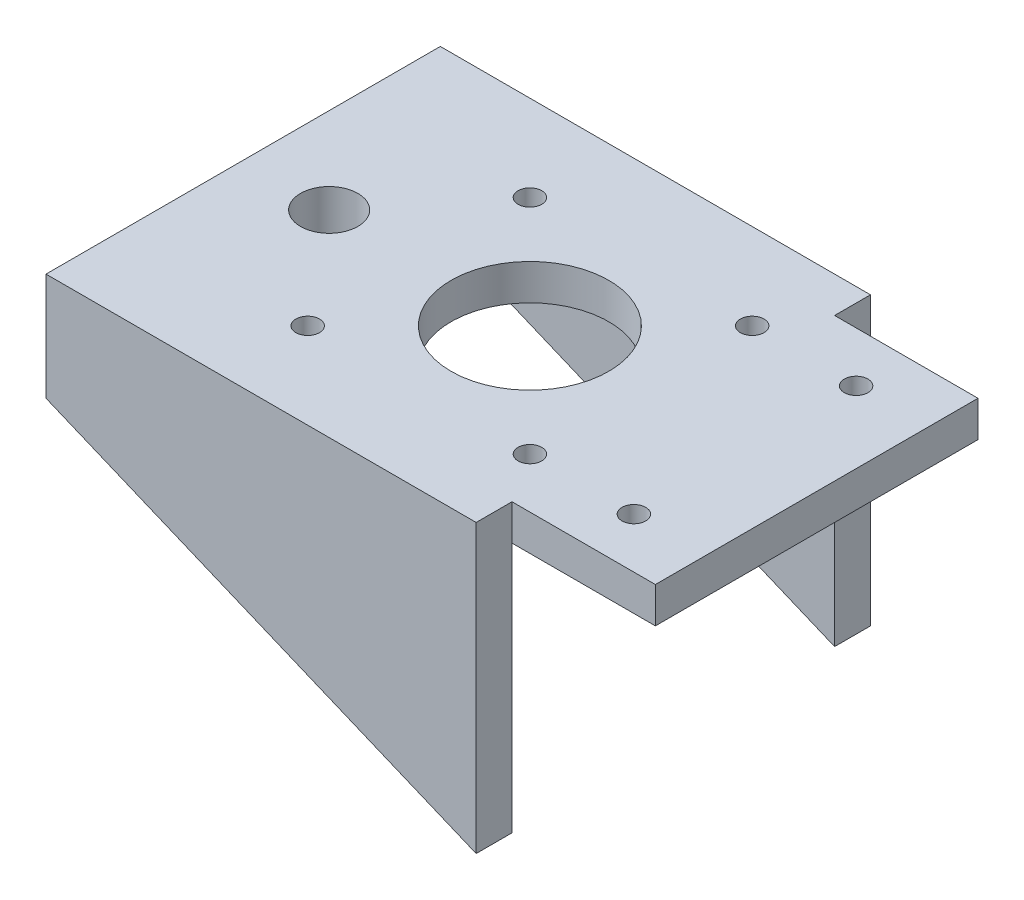
ISO-10303-21;
HEADER;
FILE_DESCRIPTION(('STEP AP214'),'2;1');
FILE_NAME('part.step','',(''),(''),'','','');
FILE_SCHEMA(('AUTOMOTIVE_DESIGN { 1 0 10303 214 1 1 1 1 }'));
ENDSEC;
DATA;
#1=APPLICATION_CONTEXT('core data for automotive mechanical design processes');
#2=APPLICATION_PROTOCOL_DEFINITION('international standard','automotive_design',2000,#1);
#3=PRODUCT_CONTEXT('',#1,'mechanical');
#4=PRODUCT('Part','Part','',(#3));
#5=PRODUCT_RELATED_PRODUCT_CATEGORY('part','',(#4));
#6=PRODUCT_DEFINITION_FORMATION('','',#4);
#7=PRODUCT_DEFINITION_CONTEXT('part definition',#1,'design');
#8=PRODUCT_DEFINITION('design','',#6,#7);
#9=PRODUCT_DEFINITION_SHAPE('','',#8);
#10=(LENGTH_UNIT() NAMED_UNIT(*) SI_UNIT(.MILLI.,.METRE.));
#11=(NAMED_UNIT(*) PLANE_ANGLE_UNIT() SI_UNIT($,.RADIAN.));
#12=(NAMED_UNIT(*) SI_UNIT($,.STERADIAN.) SOLID_ANGLE_UNIT());
#13=UNCERTAINTY_MEASURE_WITH_UNIT(LENGTH_MEASURE(1.E-05),#10,'distance_accuracy_value','');
#14=(GEOMETRIC_REPRESENTATION_CONTEXT(3) GLOBAL_UNCERTAINTY_ASSIGNED_CONTEXT((#13)) GLOBAL_UNIT_ASSIGNED_CONTEXT((#10,
#11,#12)) REPRESENTATION_CONTEXT('',''));
#15=CARTESIAN_POINT('',(0.,0.,0.));
#16=DIRECTION('',(0.,0.,1.));
#17=DIRECTION('',(1.,0.,0.));
#18=AXIS2_PLACEMENT_3D('',#15,#16,#17);
#19=CARTESIAN_POINT('',(-40.,5.,22.5));
#20=DIRECTION('',(0.,0.,-1.));
#21=DIRECTION('',(-1.,0.,0.));
#22=AXIS2_PLACEMENT_3D('',#19,#20,#21);
#23=PLANE('',#22);
#24=DIRECTION('',(0.,1.,0.));
#25=VECTOR('',#24,1.);
#26=CARTESIAN_POINT('',(20.,-35.,22.5));
#27=LINE('',#26,#25);
#28=CARTESIAN_POINT('',(20.,0.,22.5));
#29=VERTEX_POINT('',#28);
#30=CARTESIAN_POINT('',(20.,5.,22.5));
#31=VERTEX_POINT('',#30);
#32=EDGE_CURVE('E49',#29,#31,#27,.T.);
#33=ORIENTED_EDGE('',*,*,#32,.F.);
#34=DIRECTION('',(1.,0.,0.));
#35=VECTOR('',#34,1.);
#36=CARTESIAN_POINT('',(-40.,0.,22.5));
#37=LINE('',#36,#35);
#38=CARTESIAN_POINT('',(40.,0.,22.5));
#39=VERTEX_POINT('',#38);
#40=EDGE_CURVE('E296',#29,#39,#37,.T.);
#41=ORIENTED_EDGE('',*,*,#40,.T.);
#42=DIRECTION('',(0.,-1.,0.));
#43=VECTOR('',#42,1.);
#44=CARTESIAN_POINT('',(40.,5.,22.5));
#45=LINE('',#44,#43);
#46=CARTESIAN_POINT('',(40.,5.,22.5));
#47=VERTEX_POINT('',#46);
#48=EDGE_CURVE('E284',#47,#39,#45,.T.);
#49=ORIENTED_EDGE('',*,*,#48,.F.);
#50=DIRECTION('',(1.,0.,0.));
#51=VECTOR('',#50,1.);
#52=CARTESIAN_POINT('',(-40.,5.,22.5));
#53=LINE('',#52,#51);
#54=EDGE_CURVE('E281',#31,#47,#53,.T.);
#55=ORIENTED_EDGE('',*,*,#54,.F.);
#56=EDGE_LOOP('',(#33,#41,#49,#55));
#57=FACE_BOUND('',#56,.T.);
#58=ADVANCED_FACE('F39',(#57),#23,.F.);
#59=CARTESIAN_POINT('',(0.,0.,0.));
#60=DIRECTION('',(0.,1.,0.));
#61=DIRECTION('',(0.,0.,1.));
#62=AXIS2_PLACEMENT_3D('',#59,#60,#61);
#63=PLANE('',#62);
#64=DIRECTION('',(0.,0.,-1.));
#65=VECTOR('',#64,1.);
#66=CARTESIAN_POINT('',(40.,0.,-22.5));
#67=LINE('',#66,#65);
#68=CARTESIAN_POINT('',(40.,0.,-22.5));
#69=VERTEX_POINT('',#68);
#70=EDGE_CURVE('E268',#39,#69,#67,.T.);
#71=ORIENTED_EDGE('',*,*,#70,.F.);
#72=ORIENTED_EDGE('',*,*,#40,.F.);
#73=CARTESIAN_POINT('',(-40.,0.,22.5));
#74=VERTEX_POINT('',#73);
#75=EDGE_CURVE('E275',#74,#29,#37,.T.);
#76=ORIENTED_EDGE('',*,*,#75,.F.);
#77=DIRECTION('',(0.,0.,1.));
#78=VECTOR('',#77,1.);
#79=CARTESIAN_POINT('',(-40.,0.,-22.5));
#80=LINE('',#79,#78);
#81=CARTESIAN_POINT('',(-40.,0.,-22.5));
#82=VERTEX_POINT('',#81);
#83=EDGE_CURVE('E293',#82,#74,#80,.T.);
#84=ORIENTED_EDGE('',*,*,#83,.F.);
#85=DIRECTION('',(-1.,0.,0.));
#86=VECTOR('',#85,1.);
#87=CARTESIAN_POINT('',(-40.,0.,-22.5));
#88=LINE('',#87,#86);
#89=CARTESIAN_POINT('',(20.,0.,-22.5));
#90=VERTEX_POINT('',#89);
#91=EDGE_CURVE('E288',#90,#82,#88,.T.);
#92=ORIENTED_EDGE('',*,*,#91,.F.);
#93=EDGE_CURVE('E289',#69,#90,#88,.T.);
#94=ORIENTED_EDGE('',*,*,#93,.F.);
#95=EDGE_LOOP('',(#71,#72,#76,#84,#92,#94));
#96=FACE_BOUND('',#95,.T.);
#97=CARTESIAN_POINT('',(-15.5,0.,-15.5));
#98=DIRECTION('',(0.,1.,0.));
#99=DIRECTION('',(0.,0.,1.));
#100=AXIS2_PLACEMENT_3D('',#97,#98,#99);
#101=CIRCLE('',#100,1.65);
#102=CARTESIAN_POINT('',(-15.5,0.,-13.85));
#103=VERTEX_POINT('',#102);
#104=EDGE_CURVE('E264',#103,#103,#101,.T.);
#105=ORIENTED_EDGE('',*,*,#104,.T.);
#106=EDGE_LOOP('',(#105));
#107=FACE_BOUND('',#106,.T.);
#108=CARTESIAN_POINT('',(30.,0.,15.5));
#109=DIRECTION('',(0.,1.,0.));
#110=DIRECTION('',(0.,0.,1.));
#111=AXIS2_PLACEMENT_3D('',#108,#109,#110);
#112=CIRCLE('',#111,1.65);
#113=CARTESIAN_POINT('',(30.,0.,17.15));
#114=VERTEX_POINT('',#113);
#115=EDGE_CURVE('E225',#114,#114,#112,.T.);
#116=ORIENTED_EDGE('',*,*,#115,.T.);
#117=EDGE_LOOP('',(#116));
#118=FACE_BOUND('',#117,.T.);
#119=CARTESIAN_POINT('',(0.,0.,0.));
#120=DIRECTION('',(0.,1.,0.));
#121=DIRECTION('',(0.,0.,1.));
#122=AXIS2_PLACEMENT_3D('',#119,#120,#121);
#123=CIRCLE('',#122,11.);
#124=CARTESIAN_POINT('',(0.,0.,11.));
#125=VERTEX_POINT('',#124);
#126=EDGE_CURVE('E212',#125,#125,#123,.T.);
#127=ORIENTED_EDGE('',*,*,#126,.T.);
#128=EDGE_LOOP('',(#127));
#129=FACE_BOUND('',#128,.T.);
#130=CARTESIAN_POINT('',(15.5,0.,-15.5));
#131=DIRECTION('',(0.,1.,0.));
#132=DIRECTION('',(0.,0.,1.));
#133=AXIS2_PLACEMENT_3D('',#130,#131,#132);
#134=CIRCLE('',#133,1.65);
#135=CARTESIAN_POINT('',(15.5,0.,-13.85));
#136=VERTEX_POINT('',#135);
#137=EDGE_CURVE('E248',#136,#136,#134,.T.);
#138=ORIENTED_EDGE('',*,*,#137,.T.);
#139=EDGE_LOOP('',(#138));
#140=FACE_BOUND('',#139,.T.);
#141=CARTESIAN_POINT('',(15.5,0.,15.5));
#142=DIRECTION('',(0.,1.,0.));
#143=DIRECTION('',(0.,0.,1.));
#144=AXIS2_PLACEMENT_3D('',#141,#142,#143);
#145=CIRCLE('',#144,1.65);
#146=CARTESIAN_POINT('',(15.5,0.,17.15));
#147=VERTEX_POINT('',#146);
#148=EDGE_CURVE('E257',#147,#147,#145,.T.);
#149=ORIENTED_EDGE('',*,*,#148,.T.);
#150=EDGE_LOOP('',(#149));
#151=FACE_BOUND('',#150,.T.);
#152=CARTESIAN_POINT('',(-15.5,0.,15.5));
#153=DIRECTION('',(0.,1.,0.));
#154=DIRECTION('',(0.,0.,1.));
#155=AXIS2_PLACEMENT_3D('',#152,#153,#154);
#156=CIRCLE('',#155,1.65);
#157=CARTESIAN_POINT('',(-15.5,0.,17.15));
#158=VERTEX_POINT('',#157);
#159=EDGE_CURVE('E232',#158,#158,#156,.T.);
#160=ORIENTED_EDGE('',*,*,#159,.T.);
#161=EDGE_LOOP('',(#160));
#162=FACE_BOUND('',#161,.T.);
#163=CARTESIAN_POINT('',(30.,0.,-15.5));
#164=DIRECTION('',(0.,1.,0.));
#165=DIRECTION('',(0.,0.,1.));
#166=AXIS2_PLACEMENT_3D('',#163,#164,#165);
#167=CIRCLE('',#166,1.65);
#168=CARTESIAN_POINT('',(30.,0.,-13.85));
#169=VERTEX_POINT('',#168);
#170=EDGE_CURVE('E241',#169,#169,#167,.T.);
#171=ORIENTED_EDGE('',*,*,#170,.T.);
#172=EDGE_LOOP('',(#171));
#173=FACE_BOUND('',#172,.T.);
#174=CARTESIAN_POINT('',(-28.,0.,0.));
#175=DIRECTION('',(0.,1.,0.));
#176=DIRECTION('',(0.,0.,1.));
#177=AXIS2_PLACEMENT_3D('',#174,#175,#176);
#178=CIRCLE('',#177,7.5);
#179=CARTESIAN_POINT('',(-28.,0.,7.5));
#180=VERTEX_POINT('',#179);
#181=EDGE_CURVE('E43',#180,#180,#178,.F.);
#182=ORIENTED_EDGE('',*,*,#181,.F.);
#183=EDGE_LOOP('',(#182));
#184=FACE_BOUND('',#183,.T.);
#185=ADVANCED_FACE('F334',(#96,#107,#118,#129,#140,#151,#162,#173,#184),#63,.F.);
#186=CARTESIAN_POINT('',(40.,5.,-22.5));
#187=DIRECTION('',(-1.,0.,0.));
#188=DIRECTION('',(0.,0.,1.));
#189=AXIS2_PLACEMENT_3D('',#186,#187,#188);
#190=PLANE('',#189);
#191=ORIENTED_EDGE('',*,*,#70,.T.);
#192=DIRECTION('',(0.,-1.,0.));
#193=VECTOR('',#192,1.);
#194=CARTESIAN_POINT('',(40.,5.,-22.5));
#195=LINE('',#194,#193);
#196=CARTESIAN_POINT('',(40.,5.,-22.5));
#197=VERTEX_POINT('',#196);
#198=EDGE_CURVE('E302',#197,#69,#195,.T.);
#199=ORIENTED_EDGE('',*,*,#198,.F.);
#200=DIRECTION('',(0.,0.,-1.));
#201=VECTOR('',#200,1.);
#202=CARTESIAN_POINT('',(40.,5.,-22.5));
#203=LINE('',#202,#201);
#204=EDGE_CURVE('E272',#47,#197,#203,.T.);
#205=ORIENTED_EDGE('',*,*,#204,.F.);
#206=ORIENTED_EDGE('',*,*,#48,.T.);
#207=EDGE_LOOP('',(#191,#199,#205,#206));
#208=FACE_BOUND('',#207,.T.);
#209=ADVANCED_FACE('F41',(#208),#190,.F.);
#210=CARTESIAN_POINT('',(-40.,5.,-22.5));
#211=DIRECTION('',(0.,0.,1.));
#212=DIRECTION('',(1.,0.,0.));
#213=AXIS2_PLACEMENT_3D('',#210,#211,#212);
#214=PLANE('',#213);
#215=ORIENTED_EDGE('',*,*,#93,.T.);
#216=DIRECTION('',(0.,1.,0.));
#217=VECTOR('',#216,1.);
#218=CARTESIAN_POINT('',(20.,-35.,-22.5));
#219=LINE('',#218,#217);
#220=CARTESIAN_POINT('',(20.,5.,-22.5));
#221=VERTEX_POINT('',#220);
#222=EDGE_CURVE('E11',#90,#221,#219,.T.);
#223=ORIENTED_EDGE('',*,*,#222,.T.);
#224=DIRECTION('',(-1.,0.,0.));
#225=VECTOR('',#224,1.);
#226=CARTESIAN_POINT('',(-40.,5.,-22.5));
#227=LINE('',#226,#225);
#228=EDGE_CURVE('E129',#197,#221,#227,.T.);
#229=ORIENTED_EDGE('',*,*,#228,.F.);
#230=ORIENTED_EDGE('',*,*,#198,.T.);
#231=EDGE_LOOP('',(#215,#223,#229,#230));
#232=FACE_BOUND('',#231,.T.);
#233=ADVANCED_FACE('F347',(#232),#214,.F.);
#234=CARTESIAN_POINT('',(-40.,5.,-22.5));
#235=DIRECTION('',(1.,0.,0.));
#236=DIRECTION('',(0.,0.,-1.));
#237=AXIS2_PLACEMENT_3D('',#234,#235,#236);
#238=PLANE('',#237);
#239=ORIENTED_EDGE('',*,*,#83,.T.);
#240=DIRECTION('',(0.,-1.,0.));
#241=VECTOR('',#240,1.);
#242=CARTESIAN_POINT('',(-40.,5.,22.5));
#243=LINE('',#242,#241);
#244=CARTESIAN_POINT('',(-40.,-10.,22.5));
#245=VERTEX_POINT('',#244);
#246=EDGE_CURVE('E131',#74,#245,#243,.T.);
#247=ORIENTED_EDGE('',*,*,#246,.T.);
#248=DIRECTION('',(0.,0.,-1.));
#249=VECTOR('',#248,1.);
#250=CARTESIAN_POINT('',(-40.,-10.,27.5));
#251=LINE('',#250,#249);
#252=CARTESIAN_POINT('',(-40.,-10.,27.5));
#253=VERTEX_POINT('',#252);
#254=EDGE_CURVE('E199',#253,#245,#251,.T.);
#255=ORIENTED_EDGE('',*,*,#254,.F.);
#256=DIRECTION('',(0.,-1.,0.));
#257=VECTOR('',#256,1.);
#258=CARTESIAN_POINT('',(-40.,5.,27.5));
#259=LINE('',#258,#257);
#260=CARTESIAN_POINT('',(-40.,5.,27.5));
#261=VERTEX_POINT('',#260);
#262=EDGE_CURVE('E173',#261,#253,#259,.T.);
#263=ORIENTED_EDGE('',*,*,#262,.F.);
#264=DIRECTION('',(0.,0.,1.));
#265=VECTOR('',#264,1.);
#266=CARTESIAN_POINT('',(-40.,5.,-22.5));
#267=LINE('',#266,#265);
#268=CARTESIAN_POINT('',(-40.,5.,-27.5));
#269=VERTEX_POINT('',#268);
#270=EDGE_CURVE('E278',#269,#261,#267,.T.);
#271=ORIENTED_EDGE('',*,*,#270,.F.);
#272=DIRECTION('',(0.,-1.,0.));
#273=VECTOR('',#272,1.);
#274=CARTESIAN_POINT('',(-40.,5.,-27.5));
#275=LINE('',#274,#273);
#276=CARTESIAN_POINT('',(-40.,-10.,-27.5));
#277=VERTEX_POINT('',#276);
#278=EDGE_CURVE('E141',#269,#277,#275,.T.);
#279=ORIENTED_EDGE('',*,*,#278,.T.);
#280=DIRECTION('',(0.,0.,1.));
#281=VECTOR('',#280,1.);
#282=CARTESIAN_POINT('',(-40.,-10.,-27.5));
#283=LINE('',#282,#281);
#284=CARTESIAN_POINT('',(-40.,-10.,-22.5));
#285=VERTEX_POINT('',#284);
#286=EDGE_CURVE('E154',#277,#285,#283,.T.);
#287=ORIENTED_EDGE('',*,*,#286,.T.);
#288=DIRECTION('',(0.,-1.,0.));
#289=VECTOR('',#288,1.);
#290=CARTESIAN_POINT('',(-40.,5.,-22.5));
#291=LINE('',#290,#289);
#292=EDGE_CURVE('E143',#82,#285,#291,.T.);
#293=ORIENTED_EDGE('',*,*,#292,.F.);
#294=EDGE_LOOP('',(#239,#247,#255,#263,#271,#279,#287,#293));
#295=FACE_BOUND('',#294,.T.);
#296=ADVANCED_FACE('F343',(#295),#238,.F.);
#297=CARTESIAN_POINT('',(0.,5.,0.));
#298=DIRECTION('',(0.,1.,0.));
#299=DIRECTION('',(0.,0.,1.));
#300=AXIS2_PLACEMENT_3D('',#297,#298,#299);
#301=PLANE('',#300);
#302=CARTESIAN_POINT('',(30.,5.,-15.5));
#303=DIRECTION('',(0.,1.,0.));
#304=DIRECTION('',(0.,0.,1.));
#305=AXIS2_PLACEMENT_3D('',#302,#303,#304);
#306=CIRCLE('',#305,1.65);
#307=CARTESIAN_POINT('',(30.,5.,-13.85));
#308=VERTEX_POINT('',#307);
#309=EDGE_CURVE('E224',#308,#308,#306,.T.);
#310=ORIENTED_EDGE('',*,*,#309,.F.);
#311=EDGE_LOOP('',(#310));
#312=FACE_BOUND('',#311,.T.);
#313=CARTESIAN_POINT('',(-15.5,5.,15.5));
#314=DIRECTION('',(0.,1.,0.));
#315=DIRECTION('',(0.,0.,1.));
#316=AXIS2_PLACEMENT_3D('',#313,#314,#315);
#317=CIRCLE('',#316,1.65);
#318=CARTESIAN_POINT('',(-15.5,5.,17.15));
#319=VERTEX_POINT('',#318);
#320=EDGE_CURVE('E237',#319,#319,#317,.T.);
#321=ORIENTED_EDGE('',*,*,#320,.F.);
#322=EDGE_LOOP('',(#321));
#323=FACE_BOUND('',#322,.T.);
#324=CARTESIAN_POINT('',(15.5,5.,15.5));
#325=DIRECTION('',(0.,1.,0.));
#326=DIRECTION('',(0.,0.,1.));
#327=AXIS2_PLACEMENT_3D('',#324,#325,#326);
#328=CIRCLE('',#327,1.65);
#329=CARTESIAN_POINT('',(15.5,5.,17.15));
#330=VERTEX_POINT('',#329);
#331=EDGE_CURVE('E236',#330,#330,#328,.T.);
#332=ORIENTED_EDGE('',*,*,#331,.F.);
#333=EDGE_LOOP('',(#332));
#334=FACE_BOUND('',#333,.T.);
#335=CARTESIAN_POINT('',(15.5,5.,-15.5));
#336=DIRECTION('',(0.,1.,0.));
#337=DIRECTION('',(0.,0.,1.));
#338=AXIS2_PLACEMENT_3D('',#335,#336,#337);
#339=CIRCLE('',#338,1.65);
#340=CARTESIAN_POINT('',(15.5,5.,-13.85));
#341=VERTEX_POINT('',#340);
#342=EDGE_CURVE('E253',#341,#341,#339,.T.);
#343=ORIENTED_EDGE('',*,*,#342,.F.);
#344=EDGE_LOOP('',(#343));
#345=FACE_BOUND('',#344,.T.);
#346=CARTESIAN_POINT('',(0.,5.,0.));
#347=DIRECTION('',(0.,1.,0.));
#348=DIRECTION('',(0.,0.,1.));
#349=AXIS2_PLACEMENT_3D('',#346,#347,#348);
#350=CIRCLE('',#349,11.);
#351=CARTESIAN_POINT('',(0.,5.,11.));
#352=VERTEX_POINT('',#351);
#353=EDGE_CURVE('E211',#352,#352,#350,.T.);
#354=ORIENTED_EDGE('',*,*,#353,.F.);
#355=EDGE_LOOP('',(#354));
#356=FACE_BOUND('',#355,.T.);
#357=CARTESIAN_POINT('',(30.,5.,15.5));
#358=DIRECTION('',(0.,1.,0.));
#359=DIRECTION('',(0.,0.,1.));
#360=AXIS2_PLACEMENT_3D('',#357,#358,#359);
#361=CIRCLE('',#360,1.65);
#362=CARTESIAN_POINT('',(30.,5.,17.15));
#363=VERTEX_POINT('',#362);
#364=EDGE_CURVE('E216',#363,#363,#361,.T.);
#365=ORIENTED_EDGE('',*,*,#364,.F.);
#366=EDGE_LOOP('',(#365));
#367=FACE_BOUND('',#366,.T.);
#368=CARTESIAN_POINT('',(-28.,5.,0.));
#369=DIRECTION('',(0.,1.,0.));
#370=DIRECTION('',(0.,0.,1.));
#371=AXIS2_PLACEMENT_3D('',#368,#369,#370);
#372=CIRCLE('',#371,4.);
#373=CARTESIAN_POINT('',(-28.,5.,4.));
#374=VERTEX_POINT('',#373);
#375=EDGE_CURVE('E220',#374,#374,#372,.T.);
#376=ORIENTED_EDGE('',*,*,#375,.F.);
#377=EDGE_LOOP('',(#376));
#378=FACE_BOUND('',#377,.T.);
#379=CARTESIAN_POINT('',(-15.5,5.,-15.5));
#380=DIRECTION('',(0.,1.,0.));
#381=DIRECTION('',(0.,0.,1.));
#382=AXIS2_PLACEMENT_3D('',#379,#380,#381);
#383=CIRCLE('',#382,1.65);
#384=CARTESIAN_POINT('',(-15.5,5.,-13.85));
#385=VERTEX_POINT('',#384);
#386=EDGE_CURVE('E252',#385,#385,#383,.T.);
#387=ORIENTED_EDGE('',*,*,#386,.F.);
#388=EDGE_LOOP('',(#387));
#389=FACE_BOUND('',#388,.T.);
#390=ORIENTED_EDGE('',*,*,#204,.T.);
#391=ORIENTED_EDGE('',*,*,#228,.T.);
#392=DIRECTION('',(0.,0.,1.));
#393=VECTOR('',#392,1.);
#394=CARTESIAN_POINT('',(20.,5.,-27.5));
#395=LINE('',#394,#393);
#396=CARTESIAN_POINT('',(20.,5.,-27.5));
#397=VERTEX_POINT('',#396);
#398=EDGE_CURVE('E58',#397,#221,#395,.T.);
#399=ORIENTED_EDGE('',*,*,#398,.F.);
#400=DIRECTION('',(-1.,0.,0.));
#401=VECTOR('',#400,1.);
#402=CARTESIAN_POINT('',(20.,5.,-27.5));
#403=LINE('',#402,#401);
#404=EDGE_CURVE('E127',#397,#269,#403,.T.);
#405=ORIENTED_EDGE('',*,*,#404,.T.);
#406=ORIENTED_EDGE('',*,*,#270,.T.);
#407=DIRECTION('',(-1.,0.,0.));
#408=VECTOR('',#407,1.);
#409=CARTESIAN_POINT('',(20.,5.,27.5));
#410=LINE('',#409,#408);
#411=CARTESIAN_POINT('',(20.,5.,27.5));
#412=VERTEX_POINT('',#411);
#413=EDGE_CURVE('E169',#412,#261,#410,.T.);
#414=ORIENTED_EDGE('',*,*,#413,.F.);
#415=DIRECTION('',(0.,0.,-1.));
#416=VECTOR('',#415,1.);
#417=CARTESIAN_POINT('',(20.,5.,27.5));
#418=LINE('',#417,#416);
#419=EDGE_CURVE('E183',#412,#31,#418,.T.);
#420=ORIENTED_EDGE('',*,*,#419,.T.);
#421=ORIENTED_EDGE('',*,*,#54,.T.);
#422=EDGE_LOOP('',(#390,#391,#399,#405,#406,#414,#420,#421));
#423=FACE_BOUND('',#422,.T.);
#424=ADVANCED_FACE('F126',(#312,#323,#334,#345,#356,#367,#378,#389,#423),#301,.T.);
#425=CARTESIAN_POINT('',(-15.5,0.,-15.5));
#426=DIRECTION('',(0.,1.,0.));
#427=DIRECTION('',(0.,0.,1.));
#428=AXIS2_PLACEMENT_3D('',#425,#426,#427);
#429=CYLINDRICAL_SURFACE('',#428,1.65);
#430=ORIENTED_EDGE('',*,*,#104,.F.);
#431=EDGE_LOOP('',(#430));
#432=FACE_BOUND('',#431,.T.);
#433=ORIENTED_EDGE('',*,*,#386,.T.);
#434=EDGE_LOOP('',(#433));
#435=FACE_BOUND('',#434,.T.);
#436=ADVANCED_FACE('F398',(#432,#435),#429,.F.);
#437=CARTESIAN_POINT('',(-28.,0.,0.));
#438=DIRECTION('',(0.,1.,0.));
#439=DIRECTION('',(0.,0.,1.));
#440=AXIS2_PLACEMENT_3D('',#437,#438,#439);
#441=CYLINDRICAL_SURFACE('',#440,4.);
#442=ORIENTED_EDGE('',*,*,#375,.T.);
#443=EDGE_LOOP('',(#442));
#444=FACE_BOUND('',#443,.T.);
#445=CARTESIAN_POINT('',(-28.,-10.,0.));
#446=DIRECTION('',(0.,-1.,0.));
#447=DIRECTION('',(0.,0.,-1.));
#448=AXIS2_PLACEMENT_3D('',#445,#446,#447);
#449=CIRCLE('',#448,4.);
#450=CARTESIAN_POINT('',(-28.,-10.,-4.));
#451=VERTEX_POINT('',#450);
#452=EDGE_CURVE('E203',#451,#451,#449,.T.);
#453=ORIENTED_EDGE('',*,*,#452,.T.);
#454=EDGE_LOOP('',(#453));
#455=FACE_BOUND('',#454,.T.);
#456=ADVANCED_FACE('F460',(#444,#455),#441,.F.);
#457=CARTESIAN_POINT('',(30.,0.,15.5));
#458=DIRECTION('',(0.,1.,0.));
#459=DIRECTION('',(0.,0.,1.));
#460=AXIS2_PLACEMENT_3D('',#457,#458,#459);
#461=CYLINDRICAL_SURFACE('',#460,1.65);
#462=ORIENTED_EDGE('',*,*,#115,.F.);
#463=EDGE_LOOP('',(#462));
#464=FACE_BOUND('',#463,.T.);
#465=ORIENTED_EDGE('',*,*,#364,.T.);
#466=EDGE_LOOP('',(#465));
#467=FACE_BOUND('',#466,.T.);
#468=ADVANCED_FACE('F458',(#464,#467),#461,.F.);
#469=CARTESIAN_POINT('',(0.,0.,0.));
#470=DIRECTION('',(0.,1.,0.));
#471=DIRECTION('',(0.,0.,1.));
#472=AXIS2_PLACEMENT_3D('',#469,#470,#471);
#473=CYLINDRICAL_SURFACE('',#472,11.);
#474=ORIENTED_EDGE('',*,*,#126,.F.);
#475=EDGE_LOOP('',(#474));
#476=FACE_BOUND('',#475,.T.);
#477=ORIENTED_EDGE('',*,*,#353,.T.);
#478=EDGE_LOOP('',(#477));
#479=FACE_BOUND('',#478,.T.);
#480=ADVANCED_FACE('F454',(#476,#479),#473,.F.);
#481=CARTESIAN_POINT('',(15.5,0.,-15.5));
#482=DIRECTION('',(0.,1.,0.));
#483=DIRECTION('',(0.,0.,1.));
#484=AXIS2_PLACEMENT_3D('',#481,#482,#483);
#485=CYLINDRICAL_SURFACE('',#484,1.65);
#486=ORIENTED_EDGE('',*,*,#137,.F.);
#487=EDGE_LOOP('',(#486));
#488=FACE_BOUND('',#487,.T.);
#489=ORIENTED_EDGE('',*,*,#342,.T.);
#490=EDGE_LOOP('',(#489));
#491=FACE_BOUND('',#490,.T.);
#492=ADVANCED_FACE('F457',(#488,#491),#485,.F.);
#493=CARTESIAN_POINT('',(15.5,0.,15.5));
#494=DIRECTION('',(0.,1.,0.));
#495=DIRECTION('',(0.,0.,1.));
#496=AXIS2_PLACEMENT_3D('',#493,#494,#495);
#497=CYLINDRICAL_SURFACE('',#496,1.65);
#498=ORIENTED_EDGE('',*,*,#148,.F.);
#499=EDGE_LOOP('',(#498));
#500=FACE_BOUND('',#499,.T.);
#501=ORIENTED_EDGE('',*,*,#331,.T.);
#502=EDGE_LOOP('',(#501));
#503=FACE_BOUND('',#502,.T.);
#504=ADVANCED_FACE('F470',(#500,#503),#497,.F.);
#505=CARTESIAN_POINT('',(-15.5,0.,15.5));
#506=DIRECTION('',(0.,1.,0.));
#507=DIRECTION('',(0.,0.,1.));
#508=AXIS2_PLACEMENT_3D('',#505,#506,#507);
#509=CYLINDRICAL_SURFACE('',#508,1.65);
#510=ORIENTED_EDGE('',*,*,#159,.F.);
#511=EDGE_LOOP('',(#510));
#512=FACE_BOUND('',#511,.T.);
#513=ORIENTED_EDGE('',*,*,#320,.T.);
#514=EDGE_LOOP('',(#513));
#515=FACE_BOUND('',#514,.T.);
#516=ADVANCED_FACE('F467',(#512,#515),#509,.F.);
#517=CARTESIAN_POINT('',(30.,0.,-15.5));
#518=DIRECTION('',(0.,1.,0.));
#519=DIRECTION('',(0.,0.,1.));
#520=AXIS2_PLACEMENT_3D('',#517,#518,#519);
#521=CYLINDRICAL_SURFACE('',#520,1.65);
#522=ORIENTED_EDGE('',*,*,#170,.F.);
#523=EDGE_LOOP('',(#522));
#524=FACE_BOUND('',#523,.T.);
#525=ORIENTED_EDGE('',*,*,#309,.T.);
#526=EDGE_LOOP('',(#525));
#527=FACE_BOUND('',#526,.T.);
#528=ADVANCED_FACE('F449',(#524,#527),#521,.F.);
#529=CARTESIAN_POINT('',(-28.,-10.,0.));
#530=DIRECTION('',(0.,-1.,0.));
#531=DIRECTION('',(0.,0.,-1.));
#532=AXIS2_PLACEMENT_3D('',#529,#530,#531);
#533=PLANE('',#532);
#534=CARTESIAN_POINT('',(-28.,-10.,0.));
#535=DIRECTION('',(0.,-1.,0.));
#536=DIRECTION('',(0.,0.,-1.));
#537=AXIS2_PLACEMENT_3D('',#534,#535,#536);
#538=CIRCLE('',#537,7.5);
#539=CARTESIAN_POINT('',(-28.,-10.,-7.5));
#540=VERTEX_POINT('',#539);
#541=EDGE_CURVE('E207',#540,#540,#538,.T.);
#542=ORIENTED_EDGE('',*,*,#541,.T.);
#543=EDGE_LOOP('',(#542));
#544=FACE_BOUND('',#543,.T.);
#545=ORIENTED_EDGE('',*,*,#452,.F.);
#546=EDGE_LOOP('',(#545));
#547=FACE_BOUND('',#546,.T.);
#548=ADVANCED_FACE('F446',(#544,#547),#533,.T.);
#549=CARTESIAN_POINT('',(-28.,-10.,0.));
#550=DIRECTION('',(0.,1.,0.));
#551=DIRECTION('',(0.,0.,1.));
#552=AXIS2_PLACEMENT_3D('',#549,#550,#551);
#553=CYLINDRICAL_SURFACE('',#552,7.5);
#554=ORIENTED_EDGE('',*,*,#541,.F.);
#555=EDGE_LOOP('',(#554));
#556=FACE_BOUND('',#555,.T.);
#557=ORIENTED_EDGE('',*,*,#181,.T.);
#558=EDGE_LOOP('',(#557));
#559=FACE_BOUND('',#558,.T.);
#560=ADVANCED_FACE('F441',(#556,#559),#553,.T.);
#561=CARTESIAN_POINT('',(0.,0.,22.5));
#562=DIRECTION('',(0.,0.,1.));
#563=DIRECTION('',(1.,0.,0.));
#564=AXIS2_PLACEMENT_3D('',#561,#562,#563);
#565=PLANE('',#564);
#566=ORIENTED_EDGE('',*,*,#246,.F.);
#567=ORIENTED_EDGE('',*,*,#75,.T.);
#568=CARTESIAN_POINT('',(20.,-35.,22.5));
#569=VERTEX_POINT('',#568);
#570=EDGE_CURVE('E174',#569,#29,#27,.T.);
#571=ORIENTED_EDGE('',*,*,#570,.F.);
#572=DIRECTION('',(0.923076923076923,-0.384615384615385,0.));
#573=VECTOR('',#572,1.);
#574=CARTESIAN_POINT('',(-40.,-10.,22.5));
#575=LINE('',#574,#573);
#576=EDGE_CURVE('E186',#245,#569,#575,.T.);
#577=ORIENTED_EDGE('',*,*,#576,.F.);
#578=EDGE_LOOP('',(#566,#567,#571,#577));
#579=FACE_BOUND('',#578,.T.);
#580=ADVANCED_FACE('F329',(#579),#565,.F.);
#581=CARTESIAN_POINT('',(-40.,-10.,27.5));
#582=DIRECTION('',(0.384615384615385,0.923076923076923,0.));
#583=DIRECTION('',(-0.923076923076923,0.384615384615385,0.));
#584=AXIS2_PLACEMENT_3D('',#581,#582,#583);
#585=PLANE('',#584);
#586=ORIENTED_EDGE('',*,*,#576,.T.);
#587=DIRECTION('',(0.,0.,-1.));
#588=VECTOR('',#587,1.);
#589=CARTESIAN_POINT('',(20.,-35.,27.5));
#590=LINE('',#589,#588);
#591=CARTESIAN_POINT('',(20.,-35.,27.5));
#592=VERTEX_POINT('',#591);
#593=EDGE_CURVE('E195',#592,#569,#590,.T.);
#594=ORIENTED_EDGE('',*,*,#593,.F.);
#595=DIRECTION('',(0.923076923076923,-0.384615384615385,0.));
#596=VECTOR('',#595,1.);
#597=CARTESIAN_POINT('',(-40.,-10.,27.5));
#598=LINE('',#597,#596);
#599=EDGE_CURVE('E177',#253,#592,#598,.T.);
#600=ORIENTED_EDGE('',*,*,#599,.F.);
#601=ORIENTED_EDGE('',*,*,#254,.T.);
#602=EDGE_LOOP('',(#586,#594,#600,#601));
#603=FACE_BOUND('',#602,.T.);
#604=ADVANCED_FACE('F440',(#603),#585,.F.);
#605=CARTESIAN_POINT('',(20.,-35.,27.5));
#606=DIRECTION('',(-1.,0.,0.));
#607=DIRECTION('',(0.,-1.,0.));
#608=AXIS2_PLACEMENT_3D('',#605,#606,#607);
#609=PLANE('',#608);
#610=ORIENTED_EDGE('',*,*,#570,.T.);
#611=ORIENTED_EDGE('',*,*,#32,.T.);
#612=ORIENTED_EDGE('',*,*,#419,.F.);
#613=DIRECTION('',(0.,1.,0.));
#614=VECTOR('',#613,1.);
#615=CARTESIAN_POINT('',(20.,-35.,27.5));
#616=LINE('',#615,#614);
#617=EDGE_CURVE('E180',#592,#412,#616,.T.);
#618=ORIENTED_EDGE('',*,*,#617,.F.);
#619=ORIENTED_EDGE('',*,*,#593,.T.);
#620=EDGE_LOOP('',(#610,#611,#612,#618,#619));
#621=FACE_BOUND('',#620,.T.);
#622=ADVANCED_FACE('F314',(#621),#609,.F.);
#623=CARTESIAN_POINT('',(0.,0.,27.5));
#624=DIRECTION('',(0.,0.,1.));
#625=DIRECTION('',(1.,0.,0.));
#626=AXIS2_PLACEMENT_3D('',#623,#624,#625);
#627=PLANE('',#626);
#628=ORIENTED_EDGE('',*,*,#413,.T.);
#629=ORIENTED_EDGE('',*,*,#262,.T.);
#630=ORIENTED_EDGE('',*,*,#599,.T.);
#631=ORIENTED_EDGE('',*,*,#617,.T.);
#632=EDGE_LOOP('',(#628,#629,#630,#631));
#633=FACE_BOUND('',#632,.T.);
#634=ADVANCED_FACE('F321',(#633),#627,.T.);
#635=CARTESIAN_POINT('',(0.,0.,-22.5));
#636=DIRECTION('',(0.,0.,-1.));
#637=DIRECTION('',(1.,0.,0.));
#638=AXIS2_PLACEMENT_3D('',#635,#636,#637);
#639=PLANE('',#638);
#640=CARTESIAN_POINT('',(20.,-35.,-22.5));
#641=VERTEX_POINT('',#640);
#642=EDGE_CURVE('E51',#641,#90,#219,.T.);
#643=ORIENTED_EDGE('',*,*,#642,.T.);
#644=ORIENTED_EDGE('',*,*,#91,.T.);
#645=ORIENTED_EDGE('',*,*,#292,.T.);
#646=DIRECTION('',(0.923076923076923,-0.384615384615385,0.));
#647=VECTOR('',#646,1.);
#648=CARTESIAN_POINT('',(-40.,-10.,-22.5));
#649=LINE('',#648,#647);
#650=EDGE_CURVE('E158',#285,#641,#649,.T.);
#651=ORIENTED_EDGE('',*,*,#650,.T.);
#652=EDGE_LOOP('',(#643,#644,#645,#651));
#653=FACE_BOUND('',#652,.T.);
#654=ADVANCED_FACE('F341',(#653),#639,.F.);
#655=CARTESIAN_POINT('',(20.,-35.,-27.5));
#656=DIRECTION('',(1.,0.,0.));
#657=DIRECTION('',(0.,1.,0.));
#658=AXIS2_PLACEMENT_3D('',#655,#656,#657);
#659=PLANE('',#658);
#660=ORIENTED_EDGE('',*,*,#642,.F.);
#661=DIRECTION('',(0.,0.,1.));
#662=VECTOR('',#661,1.);
#663=CARTESIAN_POINT('',(20.,-35.,-27.5));
#664=LINE('',#663,#662);
#665=CARTESIAN_POINT('',(20.,-35.,-27.5));
#666=VERTEX_POINT('',#665);
#667=EDGE_CURVE('E132',#666,#641,#664,.T.);
#668=ORIENTED_EDGE('',*,*,#667,.F.);
#669=DIRECTION('',(0.,1.,0.));
#670=VECTOR('',#669,1.);
#671=CARTESIAN_POINT('',(20.,-35.,-27.5));
#672=LINE('',#671,#670);
#673=EDGE_CURVE('E138',#666,#397,#672,.T.);
#674=ORIENTED_EDGE('',*,*,#673,.T.);
#675=ORIENTED_EDGE('',*,*,#398,.T.);
#676=ORIENTED_EDGE('',*,*,#222,.F.);
#677=EDGE_LOOP('',(#660,#668,#674,#675,#676));
#678=FACE_BOUND('',#677,.T.);
#679=ADVANCED_FACE('F146',(#678),#659,.T.);
#680=CARTESIAN_POINT('',(-40.,-10.,-27.5));
#681=DIRECTION('',(-0.384615384615385,-0.923076923076923,0.));
#682=DIRECTION('',(0.923076923076923,-0.384615384615385,0.));
#683=AXIS2_PLACEMENT_3D('',#680,#681,#682);
#684=PLANE('',#683);
#685=ORIENTED_EDGE('',*,*,#650,.F.);
#686=ORIENTED_EDGE('',*,*,#286,.F.);
#687=DIRECTION('',(0.923076923076923,-0.384615384615385,0.));
#688=VECTOR('',#687,1.);
#689=CARTESIAN_POINT('',(-40.,-10.,-27.5));
#690=LINE('',#689,#688);
#691=EDGE_CURVE('E148',#277,#666,#690,.T.);
#692=ORIENTED_EDGE('',*,*,#691,.T.);
#693=ORIENTED_EDGE('',*,*,#667,.T.);
#694=EDGE_LOOP('',(#685,#686,#692,#693));
#695=FACE_BOUND('',#694,.T.);
#696=ADVANCED_FACE('F346',(#695),#684,.T.);
#697=CARTESIAN_POINT('',(0.,0.,-27.5));
#698=DIRECTION('',(0.,0.,-1.));
#699=DIRECTION('',(1.,0.,0.));
#700=AXIS2_PLACEMENT_3D('',#697,#698,#699);
#701=PLANE('',#700);
#702=ORIENTED_EDGE('',*,*,#404,.F.);
#703=ORIENTED_EDGE('',*,*,#673,.F.);
#704=ORIENTED_EDGE('',*,*,#691,.F.);
#705=ORIENTED_EDGE('',*,*,#278,.F.);
#706=EDGE_LOOP('',(#702,#703,#704,#705));
#707=FACE_BOUND('',#706,.T.);
#708=ADVANCED_FACE('F136',(#707),#701,.T.);
#709=CLOSED_SHELL('',(#58,#185,#209,#233,#296,#424,#436,#456,#468,#480,#492,#504,#516,#528,#548,
#560,#580,#604,#622,#634,#654,#679,#696,#708));
#710=MANIFOLD_SOLID_BREP('B2',#709);
#711=ADVANCED_BREP_SHAPE_REPRESENTATION('',(#18,#710),#14);
#712=SHAPE_DEFINITION_REPRESENTATION(#9,#711);
ENDSEC;
END-ISO-10303-21;
